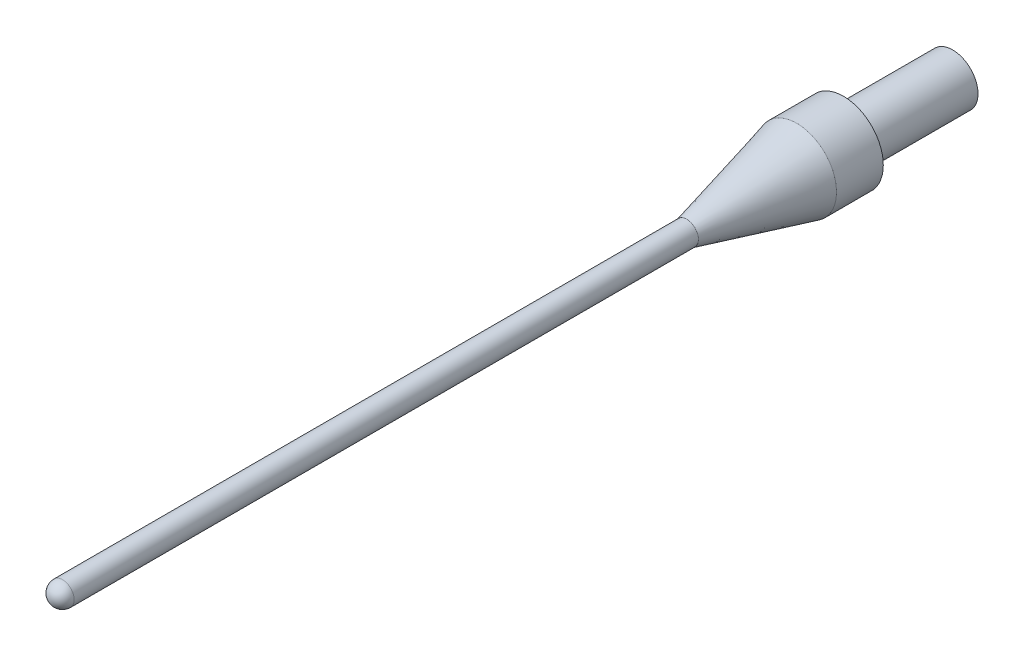
ISO-10303-21;
HEADER;
FILE_DESCRIPTION(('STEP AP214'),'2;1');
FILE_NAME('part.step','',(''),(''),'','','');
FILE_SCHEMA(('AUTOMOTIVE_DESIGN { 1 0 10303 214 1 1 1 1 }'));
ENDSEC;
DATA;
#1=APPLICATION_CONTEXT('core data for automotive mechanical design processes');
#2=APPLICATION_PROTOCOL_DEFINITION('international standard','automotive_design',2000,#1);
#3=PRODUCT_CONTEXT('',#1,'mechanical');
#4=PRODUCT('Part','Part','',(#3));
#5=PRODUCT_RELATED_PRODUCT_CATEGORY('part','',(#4));
#6=PRODUCT_DEFINITION_FORMATION('','',#4);
#7=PRODUCT_DEFINITION_CONTEXT('part definition',#1,'design');
#8=PRODUCT_DEFINITION('design','',#6,#7);
#9=PRODUCT_DEFINITION_SHAPE('','',#8);
#10=(LENGTH_UNIT() NAMED_UNIT(*) SI_UNIT(.MILLI.,.METRE.));
#11=(NAMED_UNIT(*) PLANE_ANGLE_UNIT() SI_UNIT($,.RADIAN.));
#12=(NAMED_UNIT(*) SI_UNIT($,.STERADIAN.) SOLID_ANGLE_UNIT());
#13=UNCERTAINTY_MEASURE_WITH_UNIT(LENGTH_MEASURE(1.E-05),#10,'distance_accuracy_value','');
#14=(GEOMETRIC_REPRESENTATION_CONTEXT(3) GLOBAL_UNCERTAINTY_ASSIGNED_CONTEXT((#13)) GLOBAL_UNIT_ASSIGNED_CONTEXT((#10,
#11,#12)) REPRESENTATION_CONTEXT('',''));
#15=CARTESIAN_POINT('',(0.,0.,0.));
#16=DIRECTION('',(0.,0.,1.));
#17=DIRECTION('',(1.,0.,0.));
#18=AXIS2_PLACEMENT_3D('',#15,#16,#17);
#19=CARTESIAN_POINT('',(0.,0.,6.));
#20=DIRECTION('',(0.,0.,-1.));
#21=DIRECTION('',(-1.,0.,0.));
#22=AXIS2_PLACEMENT_3D('',#19,#20,#21);
#23=CYLINDRICAL_SURFACE('',#22,5.1);
#24=CARTESIAN_POINT('',(0.,0.,6.));
#25=DIRECTION('',(0.,0.,1.));
#26=DIRECTION('',(1.,0.,0.));
#27=AXIS2_PLACEMENT_3D('',#24,#25,#26);
#28=CIRCLE('',#27,5.1);
#29=CARTESIAN_POINT('',(-5.1,0.,6.));
#30=VERTEX_POINT('',#29);
#31=EDGE_CURVE('E43',#30,#30,#28,.T.);
#32=ORIENTED_EDGE('',*,*,#31,.F.);
#33=EDGE_LOOP('',(#32));
#34=FACE_BOUND('',#33,.T.);
#35=CARTESIAN_POINT('',(0.,0.,0.));
#36=DIRECTION('',(0.,0.,1.));
#37=DIRECTION('',(1.,0.,0.));
#38=AXIS2_PLACEMENT_3D('',#35,#36,#37);
#39=CIRCLE('',#38,5.1);
#40=CARTESIAN_POINT('',(5.1,0.,0.));
#41=VERTEX_POINT('',#40);
#42=EDGE_CURVE('E46',#41,#41,#39,.T.);
#43=ORIENTED_EDGE('',*,*,#42,.T.);
#44=EDGE_LOOP('',(#43));
#45=FACE_BOUND('',#44,.T.);
#46=ADVANCED_FACE('F31',(#34,#45),#23,.T.);
#47=CARTESIAN_POINT('',(0.,0.,0.));
#48=DIRECTION('',(0.,0.,1.));
#49=DIRECTION('',(1.,0.,0.));
#50=AXIS2_PLACEMENT_3D('',#47,#48,#49);
#51=PLANE('',#50);
#52=CARTESIAN_POINT('',(0.,0.,0.));
#53=DIRECTION('',(0.,0.,1.));
#54=DIRECTION('',(1.,0.,0.));
#55=AXIS2_PLACEMENT_3D('',#52,#53,#54);
#56=CIRCLE('',#55,3.25);
#57=CARTESIAN_POINT('',(3.25,0.,0.));
#58=VERTEX_POINT('',#57);
#59=EDGE_CURVE('E39',#58,#58,#56,.F.);
#60=ORIENTED_EDGE('',*,*,#59,.F.);
#61=EDGE_LOOP('',(#60));
#62=FACE_BOUND('',#61,.T.);
#63=ORIENTED_EDGE('',*,*,#42,.F.);
#64=EDGE_LOOP('',(#63));
#65=FACE_BOUND('',#64,.T.);
#66=ADVANCED_FACE('F78',(#62,#65),#51,.F.);
#67=CARTESIAN_POINT('',(0.,0.,-14.));
#68=DIRECTION('',(0.,0.,1.));
#69=DIRECTION('',(1.,0.,0.));
#70=AXIS2_PLACEMENT_3D('',#67,#68,#69);
#71=CYLINDRICAL_SURFACE('',#70,3.25);
#72=CARTESIAN_POINT('',(0.,0.,-14.));
#73=DIRECTION('',(0.,0.,-1.));
#74=DIRECTION('',(-1.,0.,0.));
#75=AXIS2_PLACEMENT_3D('',#72,#73,#74);
#76=CIRCLE('',#75,3.25);
#77=CARTESIAN_POINT('',(-3.25,0.,-14.));
#78=VERTEX_POINT('',#77);
#79=EDGE_CURVE('E51',#78,#78,#76,.T.);
#80=ORIENTED_EDGE('',*,*,#79,.F.);
#81=EDGE_LOOP('',(#80));
#82=FACE_BOUND('',#81,.T.);
#83=ORIENTED_EDGE('',*,*,#59,.T.);
#84=EDGE_LOOP('',(#83));
#85=FACE_BOUND('',#84,.T.);
#86=ADVANCED_FACE('F72',(#82,#85),#71,.T.);
#87=CARTESIAN_POINT('',(0.,0.,-14.));
#88=DIRECTION('',(0.,0.,-1.));
#89=DIRECTION('',(-1.,0.,0.));
#90=AXIS2_PLACEMENT_3D('',#87,#88,#89);
#91=PLANE('',#90);
#92=CARTESIAN_POINT('',(0.,0.,-14.));
#93=DIRECTION('',(0.,0.,-1.));
#94=DIRECTION('',(-1.,0.,0.));
#95=AXIS2_PLACEMENT_3D('',#92,#93,#94);
#96=CIRCLE('',#95,1.);
#97=CARTESIAN_POINT('',(-1.,0.,-14.));
#98=VERTEX_POINT('',#97);
#99=EDGE_CURVE('E55',#98,#98,#96,.T.);
#100=ORIENTED_EDGE('',*,*,#99,.F.);
#101=EDGE_LOOP('',(#100));
#102=FACE_BOUND('',#101,.T.);
#103=ORIENTED_EDGE('',*,*,#79,.T.);
#104=EDGE_LOOP('',(#103));
#105=FACE_BOUND('',#104,.T.);
#106=ADVANCED_FACE('F66',(#102,#105),#91,.T.);
#107=CARTESIAN_POINT('',(0.,0.,3.));
#108=DIRECTION('',(0.,0.,-1.));
#109=DIRECTION('',(-1.,0.,0.));
#110=AXIS2_PLACEMENT_3D('',#107,#108,#109);
#111=CYLINDRICAL_SURFACE('',#110,1.);
#112=CARTESIAN_POINT('',(0.,0.,3.));
#113=DIRECTION('',(0.,0.,-1.));
#114=DIRECTION('',(-1.,0.,0.));
#115=AXIS2_PLACEMENT_3D('',#112,#113,#114);
#116=CIRCLE('',#115,1.);
#117=CARTESIAN_POINT('',(-1.,0.,3.));
#118=VERTEX_POINT('',#117);
#119=EDGE_CURVE('E54',#118,#118,#116,.T.);
#120=ORIENTED_EDGE('',*,*,#119,.F.);
#121=EDGE_LOOP('',(#120));
#122=FACE_BOUND('',#121,.T.);
#123=ORIENTED_EDGE('',*,*,#99,.T.);
#124=EDGE_LOOP('',(#123));
#125=FACE_BOUND('',#124,.T.);
#126=ADVANCED_FACE('F63',(#122,#125),#111,.F.);
#127=CARTESIAN_POINT('',(0.,0.,3.));
#128=DIRECTION('',(0.,0.,-1.));
#129=DIRECTION('',(-1.,0.,0.));
#130=AXIS2_PLACEMENT_3D('',#127,#128,#129);
#131=PLANE('',#130);
#132=ORIENTED_EDGE('',*,*,#119,.T.);
#133=EDGE_LOOP('',(#132));
#134=FACE_BOUND('',#133,.T.);
#135=ADVANCED_FACE('F61',(#134),#131,.T.);
#136=CARTESIAN_POINT('',(0.,0.,26.));
#137=DIRECTION('',(0.,0.,-1.));
#138=DIRECTION('',(-1.,0.,0.));
#139=AXIS2_PLACEMENT_3D('',#136,#137,#138);
#140=CONICAL_SURFACE('',#139,0.,0.249678981038308);
#141=CARTESIAN_POINT('',(0.,0.,20.1176470588235));
#142=DIRECTION('',(0.,0.,-1.));
#143=DIRECTION('',(-1.,0.,0.));
#144=AXIS2_PLACEMENT_3D('',#141,#142,#143);
#145=CIRCLE('',#144,1.5);
#146=CARTESIAN_POINT('',(-1.5,0.,20.1176470588235));
#147=VERTEX_POINT('',#146);
#148=EDGE_CURVE('E10',#147,#147,#145,.T.);
#149=CARTESIAN_POINT('',(-5.1,0.,6.));
#150=CARTESIAN_POINT('',(-5.0625,0.,6.14705882352941));
#151=CARTESIAN_POINT('',(-5.025,0.,6.29411764705882));
#152=CARTESIAN_POINT('',(-4.95,0.,6.58823529411765));
#153=CARTESIAN_POINT('',(-4.9125,0.,6.73529411764706));
#154=CARTESIAN_POINT('',(-4.8375,0.,7.02941176470588));
#155=CARTESIAN_POINT('',(-4.8,0.,7.17647058823529));
#156=CARTESIAN_POINT('',(-4.725,0.,7.47058823529412));
#157=CARTESIAN_POINT('',(-4.6875,0.,7.61764705882353));
#158=CARTESIAN_POINT('',(-4.6125,0.,7.91176470588235));
#159=CARTESIAN_POINT('',(-4.575,0.,8.05882352941176));
#160=CARTESIAN_POINT('',(-4.5,0.,8.35294117647059));
#161=CARTESIAN_POINT('',(-4.4625,0.,8.5));
#162=CARTESIAN_POINT('',(-4.3875,0.,8.79411764705882));
#163=CARTESIAN_POINT('',(-4.35,0.,8.94117647058824));
#164=CARTESIAN_POINT('',(-4.275,0.,9.23529411764706));
#165=CARTESIAN_POINT('',(-4.2375,0.,9.38235294117647));
#166=CARTESIAN_POINT('',(-4.1625,0.,9.6764705882353));
#167=CARTESIAN_POINT('',(-4.125,0.,9.8235294117647));
#168=CARTESIAN_POINT('',(-4.05,0.,10.1176470588235));
#169=CARTESIAN_POINT('',(-4.0125,0.,10.2647058823529));
#170=CARTESIAN_POINT('',(-3.9375,0.,10.5588235294118));
#171=CARTESIAN_POINT('',(-3.9,0.,10.7058823529412));
#172=CARTESIAN_POINT('',(-3.825,0.,11.));
#173=CARTESIAN_POINT('',(-3.7875,0.,11.1470588235294));
#174=CARTESIAN_POINT('',(-3.7125,0.,11.4411764705882));
#175=CARTESIAN_POINT('',(-3.675,0.,11.5882352941176));
#176=CARTESIAN_POINT('',(-3.6,0.,11.8823529411765));
#177=CARTESIAN_POINT('',(-3.5625,0.,12.0294117647059));
#178=CARTESIAN_POINT('',(-3.4875,0.,12.3235294117647));
#179=CARTESIAN_POINT('',(-3.45,0.,12.4705882352941));
#180=CARTESIAN_POINT('',(-3.375,0.,12.7647058823529));
#181=CARTESIAN_POINT('',(-3.3375,0.,12.9117647058824));
#182=CARTESIAN_POINT('',(-3.2625,0.,13.2058823529412));
#183=CARTESIAN_POINT('',(-3.225,0.,13.3529411764706));
#184=CARTESIAN_POINT('',(-3.15,0.,13.6470588235294));
#185=CARTESIAN_POINT('',(-3.1125,0.,13.7941176470588));
#186=CARTESIAN_POINT('',(-3.0375,0.,14.0882352941176));
#187=CARTESIAN_POINT('',(-3.,0.,14.2352941176471));
#188=CARTESIAN_POINT('',(-2.925,0.,14.5294117647059));
#189=CARTESIAN_POINT('',(-2.8875,0.,14.6764705882353));
#190=CARTESIAN_POINT('',(-2.8125,0.,14.9705882352941));
#191=CARTESIAN_POINT('',(-2.775,0.,15.1176470588235));
#192=CARTESIAN_POINT('',(-2.7,0.,15.4117647058824));
#193=CARTESIAN_POINT('',(-2.6625,0.,15.5588235294118));
#194=CARTESIAN_POINT('',(-2.5875,0.,15.8529411764706));
#195=CARTESIAN_POINT('',(-2.55,0.,16.));
#196=CARTESIAN_POINT('',(-2.475,0.,16.2941176470588));
#197=CARTESIAN_POINT('',(-2.4375,0.,16.4411764705882));
#198=CARTESIAN_POINT('',(-2.3625,0.,16.7352941176471));
#199=CARTESIAN_POINT('',(-2.325,0.,16.8823529411765));
#200=CARTESIAN_POINT('',(-2.25,0.,17.1764705882353));
#201=CARTESIAN_POINT('',(-2.2125,0.,17.3235294117647));
#202=CARTESIAN_POINT('',(-2.1375,0.,17.6176470588235));
#203=CARTESIAN_POINT('',(-2.1,0.,17.7647058823529));
#204=CARTESIAN_POINT('',(-2.025,0.,18.0588235294118));
#205=CARTESIAN_POINT('',(-1.9875,0.,18.2058823529412));
#206=CARTESIAN_POINT('',(-1.9125,0.,18.5));
#207=CARTESIAN_POINT('',(-1.875,0.,18.6470588235294));
#208=CARTESIAN_POINT('',(-1.8,0.,18.9411764705882));
#209=CARTESIAN_POINT('',(-1.7625,0.,19.0882352941177));
#210=CARTESIAN_POINT('',(-1.6875,0.,19.3823529411765));
#211=CARTESIAN_POINT('',(-1.65,0.,19.5294117647059));
#212=CARTESIAN_POINT('',(-1.575,0.,19.8235294117647));
#213=CARTESIAN_POINT('',(-1.5375,0.,19.9705882352941));
#214=CARTESIAN_POINT('',(-1.5,0.,20.1176470588235));
#215=B_SPLINE_CURVE_WITH_KNOTS('',3,(#149,#150,#151,#152,#153,#154,#155,#156,#157,#158,#159,
#160,#161,#162,#163,#164,#165,#166,#167,#168,#169,#170,#171,#172,#173,#174,#175,#176,#177,#178,
#179,#180,#181,#182,#183,#184,#185,#186,#187,#188,#189,#190,#191,#192,#193,#194,#195,#196,#197,
#198,#199,#200,#201,#202,#203,#204,#205,#206,#207,#208,#209,#210,#211,#212,#213,#214),
.UNSPECIFIED.,.F.,.F.,(4,2,2,2,2,2,2,2,2,2,2,2,2,2,2,2,2,2,2,2,2,2,2,2,2,2,2,2,2,2,2,2,4),(0.,
0.4552943313953,0.910588662790596,1.3658829941859,1.8211773255812,2.27647165697649,
2.73176598837179,3.18706031976709,3.64235465116239,4.09764898255769,4.55294331395299,
5.00823764534829,5.46353197674359,5.91882630813889,6.37412063953419,6.82941497092949,
7.28470930232478,7.74000363372008,8.19529796511538,8.65059229651068,9.10588662790598,
9.56118095930128,10.0164752906966,10.4717696220919,10.9270639534872,11.3823582848825,
11.8376526162778,12.2929469476731,12.7482412790684,13.2035356104637,13.658829941859,
14.1141242732543,14.5694186046496),.UNSPECIFIED.);
#216=EDGE_CURVE('BSEAM99',#30,#147,#215,.T.);
#217=ORIENTED_EDGE('',*,*,#31,.T.);
#218=ORIENTED_EDGE('',*,*,#148,.T.);
#219=ORIENTED_EDGE('',*,*,#216,.T.);
#220=ORIENTED_EDGE('',*,*,#216,.F.);
#221=EDGE_LOOP('',(#217,#219,#218,#220));
#222=FACE_BOUND('',#221,.T.);
#223=ADVANCED_FACE('F99',(#222),#140,.T.);
#224=CARTESIAN_POINT('',(0.,0.,100.2));
#225=DIRECTION('',(0.,0.,1.));
#226=DIRECTION('',(1.,0.,0.));
#227=AXIS2_PLACEMENT_3D('',#224,#225,#226);
#228=SPHERICAL_SURFACE('',#227,1.5);
#229=CARTESIAN_POINT('',(0.,0.,100.2));
#230=DIRECTION('',(0.,0.,1.));
#231=DIRECTION('',(1.,0.,0.));
#232=AXIS2_PLACEMENT_3D('',#229,#230,#231);
#233=CIRCLE('',#232,1.5);
#234=CARTESIAN_POINT('',(1.5,0.,100.2));
#235=VERTEX_POINT('',#234);
#236=EDGE_CURVE('E35',#235,#235,#233,.T.);
#237=ORIENTED_EDGE('',*,*,#236,.T.);
#238=EDGE_LOOP('',(#237));
#239=FACE_BOUND('',#238,.T.);
#240=ADVANCED_FACE('F33',(#239),#228,.T.);
#241=CARTESIAN_POINT('',(0.,0.,100.2));
#242=DIRECTION('',(0.,0.,-1.));
#243=DIRECTION('',(-1.,0.,0.));
#244=AXIS2_PLACEMENT_3D('',#241,#242,#243);
#245=CYLINDRICAL_SURFACE('',#244,1.5);
#246=ORIENTED_EDGE('',*,*,#236,.F.);
#247=EDGE_LOOP('',(#246));
#248=FACE_BOUND('',#247,.T.);
#249=ORIENTED_EDGE('',*,*,#148,.F.);
#250=EDGE_LOOP('',(#249));
#251=FACE_BOUND('',#250,.T.);
#252=ADVANCED_FACE('F93',(#248,#251),#245,.T.);
#253=CLOSED_SHELL('',(#46,#66,#86,#106,#126,#135,#223,#240,#252));
#254=MANIFOLD_SOLID_BREP('B2',#253);
#255=ADVANCED_BREP_SHAPE_REPRESENTATION('',(#18,#254),#14);
#256=SHAPE_DEFINITION_REPRESENTATION(#9,#255);
ENDSEC;
END-ISO-10303-21;
